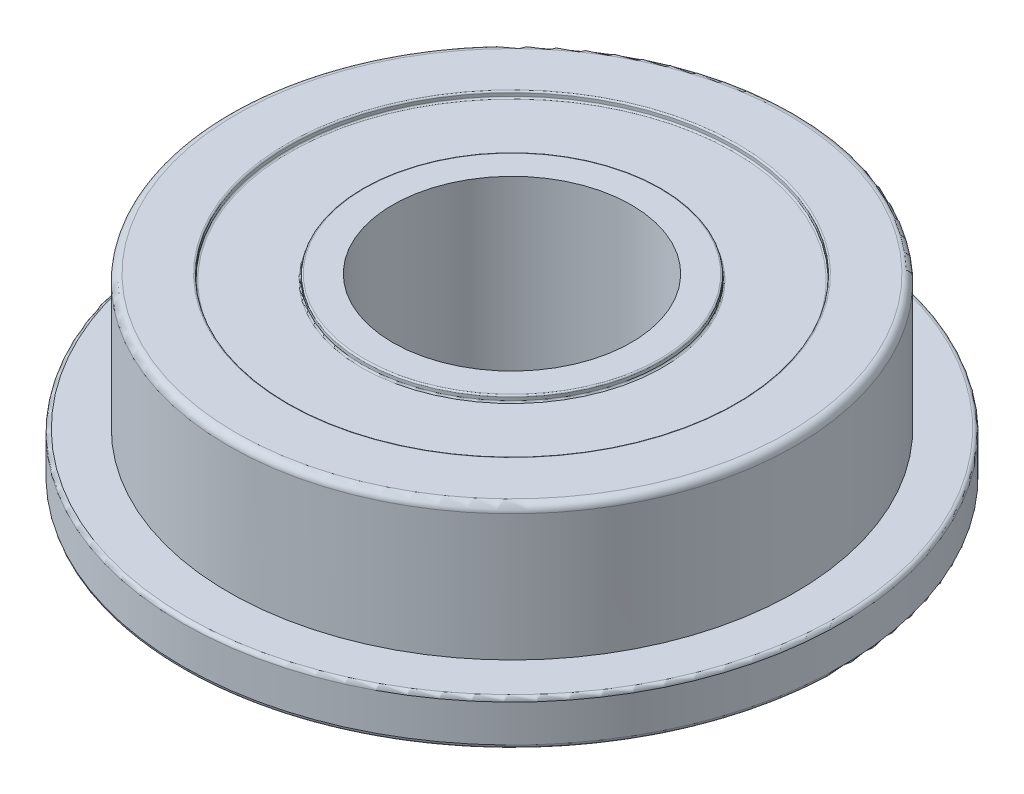
ISO-10303-21;
HEADER;
FILE_DESCRIPTION(('STEP AP214'),'2;1');
FILE_NAME('part.step','',(''),(''),'','','');
FILE_SCHEMA(('AUTOMOTIVE_DESIGN { 1 0 10303 214 1 1 1 1 }'));
ENDSEC;
DATA;
#1=APPLICATION_CONTEXT('core data for automotive mechanical design processes');
#2=APPLICATION_PROTOCOL_DEFINITION('international standard','automotive_design',2000,#1);
#3=PRODUCT_CONTEXT('',#1,'mechanical');
#4=PRODUCT('Part','Part','',(#3));
#5=PRODUCT_RELATED_PRODUCT_CATEGORY('part','',(#4));
#6=PRODUCT_DEFINITION_FORMATION('','',#4);
#7=PRODUCT_DEFINITION_CONTEXT('part definition',#1,'design');
#8=PRODUCT_DEFINITION('design','',#6,#7);
#9=PRODUCT_DEFINITION_SHAPE('','',#8);
#10=(LENGTH_UNIT() NAMED_UNIT(*) SI_UNIT(.MILLI.,.METRE.));
#11=(NAMED_UNIT(*) PLANE_ANGLE_UNIT() SI_UNIT($,.RADIAN.));
#12=(NAMED_UNIT(*) SI_UNIT($,.STERADIAN.) SOLID_ANGLE_UNIT());
#13=UNCERTAINTY_MEASURE_WITH_UNIT(LENGTH_MEASURE(1.E-05),#10,'distance_accuracy_value','');
#14=(GEOMETRIC_REPRESENTATION_CONTEXT(3) GLOBAL_UNCERTAINTY_ASSIGNED_CONTEXT((#13)) GLOBAL_UNIT_ASSIGNED_CONTEXT((#10,
#11,#12)) REPRESENTATION_CONTEXT('',''));
#15=CARTESIAN_POINT('',(0.,0.,0.));
#16=DIRECTION('',(0.,0.,1.));
#17=DIRECTION('',(1.,0.,0.));
#18=AXIS2_PLACEMENT_3D('',#15,#16,#17);
#19=CARTESIAN_POINT('',(0.,5.8,0.));
#20=DIRECTION('',(0.,1.,0.));
#21=DIRECTION('',(1.,0.,0.));
#22=AXIS2_PLACEMENT_3D('',#19,#20,#21);
#23=PLANE('',#22);
#24=CARTESIAN_POINT('',(0.,5.8,0.));
#25=DIRECTION('',(0.,-1.,0.));
#26=DIRECTION('',(0.,0.,1.));
#27=AXIS2_PLACEMENT_3D('',#24,#25,#26);
#28=CIRCLE('',#27,5.05);
#29=CARTESIAN_POINT('',(0.,5.8,5.05));
#30=VERTEX_POINT('',#29);
#31=EDGE_CURVE('E63',#30,#30,#28,.T.);
#32=ORIENTED_EDGE('',*,*,#31,.T.);
#33=EDGE_LOOP('',(#32));
#34=FACE_BOUND('',#33,.T.);
#35=CARTESIAN_POINT('',(0.,5.8,0.));
#36=DIRECTION('',(0.,1.,0.));
#37=DIRECTION('',(0.,0.,1.));
#38=AXIS2_PLACEMENT_3D('',#35,#36,#37);
#39=CIRCLE('',#38,7.45);
#40=CARTESIAN_POINT('',(0.,5.8,7.45));
#41=VERTEX_POINT('',#40);
#42=EDGE_CURVE('E43',#41,#41,#39,.T.);
#43=ORIENTED_EDGE('',*,*,#42,.T.);
#44=EDGE_LOOP('',(#43));
#45=FACE_BOUND('',#44,.T.);
#46=ADVANCED_FACE('F14',(#34,#45),#23,.T.);
#47=CARTESIAN_POINT('',(9.5,1.5,0.));
#48=DIRECTION('',(0.,1.,0.));
#49=DIRECTION('',(1.,0.,0.));
#50=AXIS2_PLACEMENT_3D('',#47,#48,#49);
#51=PLANE('',#50);
#52=CARTESIAN_POINT('',(0.,1.5,0.));
#53=DIRECTION('',(0.,-1.,0.));
#54=DIRECTION('',(0.,0.,-1.));
#55=AXIS2_PLACEMENT_3D('',#52,#53,#54);
#56=CIRCLE('',#55,9.5);
#57=CARTESIAN_POINT('',(0.,1.5,-9.5));
#58=VERTEX_POINT('',#57);
#59=EDGE_CURVE('E9',#58,#58,#56,.T.);
#60=ORIENTED_EDGE('',*,*,#59,.T.);
#61=EDGE_LOOP('',(#60));
#62=FACE_BOUND('',#61,.T.);
#63=CARTESIAN_POINT('',(0.,1.5,0.));
#64=DIRECTION('',(0.,1.,0.));
#65=DIRECTION('',(0.,0.,1.));
#66=AXIS2_PLACEMENT_3D('',#63,#64,#65);
#67=CIRCLE('',#66,10.922);
#68=CARTESIAN_POINT('',(0.,1.5,10.922));
#69=VERTEX_POINT('',#68);
#70=EDGE_CURVE('E79',#69,#69,#67,.T.);
#71=ORIENTED_EDGE('',*,*,#70,.T.);
#72=EDGE_LOOP('',(#71));
#73=FACE_BOUND('',#72,.T.);
#74=ADVANCED_FACE('F119',(#62,#73),#51,.T.);
#75=CARTESIAN_POINT('',(11.049,0.,0.));
#76=DIRECTION('',(0.,-1.,0.));
#77=DIRECTION('',(0.,0.,-1.));
#78=AXIS2_PLACEMENT_3D('',#75,#76,#77);
#79=PLANE('',#78);
#80=CARTESIAN_POINT('',(0.,0.,0.));
#81=DIRECTION('',(0.,-1.,0.));
#82=DIRECTION('',(0.,0.,-1.));
#83=AXIS2_PLACEMENT_3D('',#80,#81,#82);
#84=CIRCLE('',#83,4.);
#85=CARTESIAN_POINT('',(0.,0.,-4.));
#86=VERTEX_POINT('',#85);
#87=EDGE_CURVE('E21',#86,#86,#84,.T.);
#88=ORIENTED_EDGE('',*,*,#87,.F.);
#89=EDGE_LOOP('',(#88));
#90=FACE_BOUND('',#89,.T.);
#91=CARTESIAN_POINT('',(0.,0.,0.));
#92=DIRECTION('',(0.,-1.,0.));
#93=DIRECTION('',(0.,0.,-1.));
#94=AXIS2_PLACEMENT_3D('',#91,#92,#93);
#95=CIRCLE('',#94,10.922);
#96=CARTESIAN_POINT('',(0.,0.,-10.922));
#97=VERTEX_POINT('',#96);
#98=EDGE_CURVE('E71',#97,#97,#95,.T.);
#99=ORIENTED_EDGE('',*,*,#98,.T.);
#100=EDGE_LOOP('',(#99));
#101=FACE_BOUND('',#100,.T.);
#102=ADVANCED_FACE('F124',(#90,#101),#79,.T.);
#103=CARTESIAN_POINT('',(4.,6.,0.));
#104=DIRECTION('',(0.,1.,0.));
#105=DIRECTION('',(1.,0.,0.));
#106=AXIS2_PLACEMENT_3D('',#103,#104,#105);
#107=PLANE('',#106);
#108=CARTESIAN_POINT('',(0.,6.,0.));
#109=DIRECTION('',(0.,-1.,0.));
#110=DIRECTION('',(0.,0.,1.));
#111=AXIS2_PLACEMENT_3D('',#108,#109,#110);
#112=CIRCLE('',#111,7.55);
#113=CARTESIAN_POINT('',(0.,6.,7.55));
#114=VERTEX_POINT('',#113);
#115=EDGE_CURVE('E520',#114,#114,#112,.T.);
#116=ORIENTED_EDGE('',*,*,#115,.T.);
#117=EDGE_LOOP('',(#116));
#118=FACE_BOUND('',#117,.T.);
#119=CARTESIAN_POINT('',(0.,6.,0.));
#120=DIRECTION('',(0.,1.,0.));
#121=DIRECTION('',(0.,0.,1.));
#122=AXIS2_PLACEMENT_3D('',#119,#120,#121);
#123=CIRCLE('',#122,9.246);
#124=CARTESIAN_POINT('',(0.,6.,9.246));
#125=VERTEX_POINT('',#124);
#126=EDGE_CURVE('E38',#125,#125,#123,.T.);
#127=ORIENTED_EDGE('',*,*,#126,.T.);
#128=EDGE_LOOP('',(#127));
#129=FACE_BOUND('',#128,.T.);
#130=ADVANCED_FACE('F93',(#118,#129),#107,.T.);
#131=CARTESIAN_POINT('',(4.,6.,0.));
#132=DIRECTION('',(0.,1.,0.));
#133=DIRECTION('',(1.,0.,0.));
#134=AXIS2_PLACEMENT_3D('',#131,#132,#133);
#135=PLANE('',#134);
#136=CARTESIAN_POINT('',(0.,6.,0.));
#137=DIRECTION('',(0.,-1.,0.));
#138=DIRECTION('',(0.,0.,-1.));
#139=AXIS2_PLACEMENT_3D('',#136,#137,#138);
#140=CIRCLE('',#139,4.);
#141=CARTESIAN_POINT('',(0.,6.,-4.));
#142=VERTEX_POINT('',#141);
#143=EDGE_CURVE('E30',#142,#142,#140,.T.);
#144=ORIENTED_EDGE('',*,*,#143,.T.);
#145=EDGE_LOOP('',(#144));
#146=FACE_BOUND('',#145,.T.);
#147=CARTESIAN_POINT('',(0.,6.,0.));
#148=DIRECTION('',(0.,1.,0.));
#149=DIRECTION('',(0.,0.,1.));
#150=AXIS2_PLACEMENT_3D('',#147,#148,#149);
#151=CIRCLE('',#150,4.95);
#152=CARTESIAN_POINT('',(0.,6.,4.95));
#153=VERTEX_POINT('',#152);
#154=EDGE_CURVE('E55',#153,#153,#151,.T.);
#155=ORIENTED_EDGE('',*,*,#154,.T.);
#156=EDGE_LOOP('',(#155));
#157=FACE_BOUND('',#156,.T.);
#158=ADVANCED_FACE('F106',(#146,#157),#135,.T.);
#159=CARTESIAN_POINT('',(0.,0.,0.));
#160=DIRECTION('',(0.,-1.,0.));
#161=DIRECTION('',(0.,0.,-1.));
#162=AXIS2_PLACEMENT_3D('',#159,#160,#161);
#163=CYLINDRICAL_SURFACE('',#162,9.5);
#164=ORIENTED_EDGE('',*,*,#59,.F.);
#165=EDGE_LOOP('',(#164));
#166=FACE_BOUND('',#165,.T.);
#167=CARTESIAN_POINT('',(0.,5.746,0.));
#168=DIRECTION('',(0.,-1.,0.));
#169=DIRECTION('',(0.,0.,1.));
#170=AXIS2_PLACEMENT_3D('',#167,#168,#169);
#171=CIRCLE('',#170,9.5);
#172=CARTESIAN_POINT('',(0.,5.746,9.5));
#173=VERTEX_POINT('',#172);
#174=EDGE_CURVE('E83',#173,#173,#171,.T.);
#175=ORIENTED_EDGE('',*,*,#174,.T.);
#176=EDGE_LOOP('',(#175));
#177=FACE_BOUND('',#176,.T.);
#178=ADVANCED_FACE('F103',(#166,#177),#163,.T.);
#179=CARTESIAN_POINT('',(0.,0.,0.));
#180=DIRECTION('',(0.,-1.,0.));
#181=DIRECTION('',(0.,0.,-1.));
#182=AXIS2_PLACEMENT_3D('',#179,#180,#181);
#183=CYLINDRICAL_SURFACE('',#182,4.);
#184=ORIENTED_EDGE('',*,*,#87,.T.);
#185=EDGE_LOOP('',(#184));
#186=FACE_BOUND('',#185,.T.);
#187=ORIENTED_EDGE('',*,*,#143,.F.);
#188=EDGE_LOOP('',(#187));
#189=FACE_BOUND('',#188,.T.);
#190=ADVANCED_FACE('F105',(#186,#189),#183,.F.);
#191=CARTESIAN_POINT('',(0.,0.,0.));
#192=DIRECTION('',(0.,-1.,0.));
#193=DIRECTION('',(0.,0.,-1.));
#194=AXIS2_PLACEMENT_3D('',#191,#192,#193);
#195=CYLINDRICAL_SURFACE('',#194,11.049);
#196=CARTESIAN_POINT('',(0.,0.127,0.));
#197=DIRECTION('',(0.,1.,0.));
#198=DIRECTION('',(0.,0.,-1.));
#199=AXIS2_PLACEMENT_3D('',#196,#197,#198);
#200=CIRCLE('',#199,11.049);
#201=CARTESIAN_POINT('',(0.,0.127,-11.049));
#202=VERTEX_POINT('',#201);
#203=EDGE_CURVE('E67',#202,#202,#200,.T.);
#204=ORIENTED_EDGE('',*,*,#203,.T.);
#205=EDGE_LOOP('',(#204));
#206=FACE_BOUND('',#205,.T.);
#207=CARTESIAN_POINT('',(0.,1.373,0.));
#208=DIRECTION('',(0.,-1.,0.));
#209=DIRECTION('',(0.,0.,1.));
#210=AXIS2_PLACEMENT_3D('',#207,#208,#209);
#211=CIRCLE('',#210,11.049);
#212=CARTESIAN_POINT('',(0.,1.373,11.049));
#213=VERTEX_POINT('',#212);
#214=EDGE_CURVE('E75',#213,#213,#211,.T.);
#215=ORIENTED_EDGE('',*,*,#214,.T.);
#216=EDGE_LOOP('',(#215));
#217=FACE_BOUND('',#216,.T.);
#218=ADVANCED_FACE('F99',(#206,#217),#195,.T.);
#219=CARTESIAN_POINT('',(0.,5.746,0.));
#220=DIRECTION('',(0.,1.,0.));
#221=DIRECTION('',(0.,0.,1.));
#222=AXIS2_PLACEMENT_3D('',#219,#220,#221);
#223=TOROIDAL_SURFACE('',#222,9.246,0.254);
#224=ORIENTED_EDGE('',*,*,#126,.F.);
#225=EDGE_LOOP('',(#224));
#226=FACE_BOUND('',#225,.T.);
#227=ORIENTED_EDGE('',*,*,#174,.F.);
#228=EDGE_LOOP('',(#227));
#229=FACE_BOUND('',#228,.T.);
#230=ADVANCED_FACE('F95',(#226,#229),#223,.T.);
#231=CARTESIAN_POINT('',(0.,1.373,0.));
#232=DIRECTION('',(0.,1.,0.));
#233=DIRECTION('',(0.,0.,1.));
#234=AXIS2_PLACEMENT_3D('',#231,#232,#233);
#235=TOROIDAL_SURFACE('',#234,10.922,0.127);
#236=ORIENTED_EDGE('',*,*,#70,.F.);
#237=EDGE_LOOP('',(#236));
#238=FACE_BOUND('',#237,.T.);
#239=ORIENTED_EDGE('',*,*,#214,.F.);
#240=EDGE_LOOP('',(#239));
#241=FACE_BOUND('',#240,.T.);
#242=ADVANCED_FACE('F98',(#238,#241),#235,.T.);
#243=CARTESIAN_POINT('',(0.,0.127,0.));
#244=DIRECTION('',(0.,-1.,0.));
#245=DIRECTION('',(0.,0.,-1.));
#246=AXIS2_PLACEMENT_3D('',#243,#244,#245);
#247=TOROIDAL_SURFACE('',#246,10.922,0.127);
#248=ORIENTED_EDGE('',*,*,#98,.F.);
#249=EDGE_LOOP('',(#248));
#250=FACE_BOUND('',#249,.T.);
#251=ORIENTED_EDGE('',*,*,#203,.F.);
#252=EDGE_LOOP('',(#251));
#253=FACE_BOUND('',#252,.T.);
#254=ADVANCED_FACE('F161',(#250,#253),#247,.T.);
#255=CARTESIAN_POINT('',(0.,5.8,0.));
#256=DIRECTION('',(0.,1.,0.));
#257=DIRECTION('',(0.,0.,1.));
#258=AXIS2_PLACEMENT_3D('',#255,#256,#257);
#259=CYLINDRICAL_SURFACE('',#258,7.5);
#260=CARTESIAN_POINT('',(0.,5.95,0.));
#261=DIRECTION('',(0.,1.,0.));
#262=DIRECTION('',(0.,0.,1.));
#263=AXIS2_PLACEMENT_3D('',#260,#261,#262);
#264=CIRCLE('',#263,7.5);
#265=CARTESIAN_POINT('',(0.,5.95,7.5));
#266=VERTEX_POINT('',#265);
#267=EDGE_CURVE('E41',#266,#266,#264,.T.);
#268=ORIENTED_EDGE('',*,*,#267,.T.);
#269=EDGE_LOOP('',(#268));
#270=FACE_BOUND('',#269,.T.);
#271=CARTESIAN_POINT('',(0.,5.85,0.));
#272=DIRECTION('',(0.,-1.,0.));
#273=DIRECTION('',(0.,0.,1.));
#274=AXIS2_PLACEMENT_3D('',#271,#272,#273);
#275=CIRCLE('',#274,7.5);
#276=CARTESIAN_POINT('',(0.,5.85,7.5));
#277=VERTEX_POINT('',#276);
#278=EDGE_CURVE('E47',#277,#277,#275,.T.);
#279=ORIENTED_EDGE('',*,*,#278,.T.);
#280=EDGE_LOOP('',(#279));
#281=FACE_BOUND('',#280,.T.);
#282=ADVANCED_FACE('F158',(#270,#281),#259,.F.);
#283=CARTESIAN_POINT('',(0.,5.8,0.));
#284=DIRECTION('',(0.,1.,0.));
#285=DIRECTION('',(0.,0.,1.));
#286=AXIS2_PLACEMENT_3D('',#283,#284,#285);
#287=CYLINDRICAL_SURFACE('',#286,5.);
#288=CARTESIAN_POINT('',(0.,5.95,0.));
#289=DIRECTION('',(0.,-1.,0.));
#290=DIRECTION('',(0.,0.,1.));
#291=AXIS2_PLACEMENT_3D('',#288,#289,#290);
#292=CIRCLE('',#291,5.);
#293=CARTESIAN_POINT('',(0.,5.95,5.));
#294=VERTEX_POINT('',#293);
#295=EDGE_CURVE('E51',#294,#294,#292,.T.);
#296=ORIENTED_EDGE('',*,*,#295,.T.);
#297=EDGE_LOOP('',(#296));
#298=FACE_BOUND('',#297,.T.);
#299=CARTESIAN_POINT('',(0.,5.85,0.));
#300=DIRECTION('',(0.,1.,0.));
#301=DIRECTION('',(0.,0.,1.));
#302=AXIS2_PLACEMENT_3D('',#299,#300,#301);
#303=CIRCLE('',#302,5.);
#304=CARTESIAN_POINT('',(0.,5.85,5.));
#305=VERTEX_POINT('',#304);
#306=EDGE_CURVE('E59',#305,#305,#303,.T.);
#307=ORIENTED_EDGE('',*,*,#306,.T.);
#308=EDGE_LOOP('',(#307));
#309=FACE_BOUND('',#308,.T.);
#310=ADVANCED_FACE('F148',(#298,#309),#287,.T.);
#311=CARTESIAN_POINT('',(0.,5.85,0.));
#312=DIRECTION('',(0.,1.,0.));
#313=DIRECTION('',(0.,0.,1.));
#314=AXIS2_PLACEMENT_3D('',#311,#312,#313);
#315=TOROIDAL_SURFACE('',#314,5.05,0.05);
#316=ORIENTED_EDGE('',*,*,#31,.F.);
#317=EDGE_LOOP('',(#316));
#318=FACE_BOUND('',#317,.T.);
#319=ORIENTED_EDGE('',*,*,#306,.F.);
#320=EDGE_LOOP('',(#319));
#321=FACE_BOUND('',#320,.T.);
#322=ADVANCED_FACE('F141',(#318,#321),#315,.F.);
#323=CARTESIAN_POINT('',(0.,5.95,0.));
#324=DIRECTION('',(0.,1.,0.));
#325=DIRECTION('',(0.,0.,1.));
#326=AXIS2_PLACEMENT_3D('',#323,#324,#325);
#327=TOROIDAL_SURFACE('',#326,4.95,0.05);
#328=ORIENTED_EDGE('',*,*,#154,.F.);
#329=EDGE_LOOP('',(#328));
#330=FACE_BOUND('',#329,.T.);
#331=ORIENTED_EDGE('',*,*,#295,.F.);
#332=EDGE_LOOP('',(#331));
#333=FACE_BOUND('',#332,.T.);
#334=ADVANCED_FACE('F132',(#330,#333),#327,.T.);
#335=CARTESIAN_POINT('',(0.,5.85,0.));
#336=DIRECTION('',(0.,1.,0.));
#337=DIRECTION('',(0.,0.,1.));
#338=AXIS2_PLACEMENT_3D('',#335,#336,#337);
#339=TOROIDAL_SURFACE('',#338,7.45,0.05);
#340=ORIENTED_EDGE('',*,*,#278,.F.);
#341=EDGE_LOOP('',(#340));
#342=FACE_BOUND('',#341,.T.);
#343=ORIENTED_EDGE('',*,*,#42,.F.);
#344=EDGE_LOOP('',(#343));
#345=FACE_BOUND('',#344,.T.);
#346=ADVANCED_FACE('F129',(#342,#345),#339,.F.);
#347=CARTESIAN_POINT('',(0.,5.95,0.));
#348=DIRECTION('',(0.,1.,0.));
#349=DIRECTION('',(0.,0.,1.));
#350=AXIS2_PLACEMENT_3D('',#347,#348,#349);
#351=TOROIDAL_SURFACE('',#350,7.55,0.05);
#352=ORIENTED_EDGE('',*,*,#267,.F.);
#353=EDGE_LOOP('',(#352));
#354=FACE_BOUND('',#353,.T.);
#355=ORIENTED_EDGE('',*,*,#115,.F.);
#356=EDGE_LOOP('',(#355));
#357=FACE_BOUND('',#356,.T.);
#358=ADVANCED_FACE('F131',(#354,#357),#351,.T.);
#359=CLOSED_SHELL('',(#46,#74,#102,#130,#158,#178,#190,#218,#230,#242,#254,#282,#310,#322,#334,
#346,#358));
#360=MANIFOLD_SOLID_BREP('B1',#359);
#361=ADVANCED_BREP_SHAPE_REPRESENTATION('',(#18,#360),#14);
#362=SHAPE_DEFINITION_REPRESENTATION(#9,#361);
ENDSEC;
END-ISO-10303-21;
